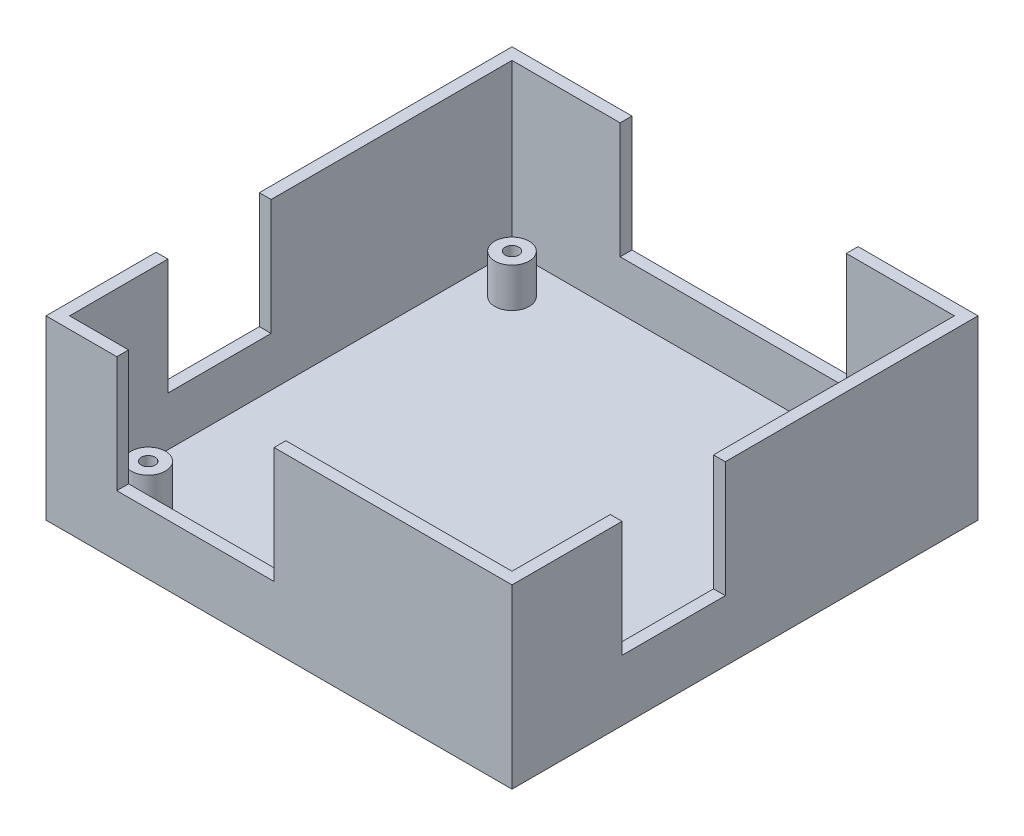
ISO-10303-21;
HEADER;
FILE_DESCRIPTION(('STEP AP214'),'2;1');
FILE_NAME('part.step','',(''),(''),'','','');
FILE_SCHEMA(('AUTOMOTIVE_DESIGN { 1 0 10303 214 1 1 1 1 }'));
ENDSEC;
DATA;
#1=APPLICATION_CONTEXT('core data for automotive mechanical design processes');
#2=APPLICATION_PROTOCOL_DEFINITION('international standard','automotive_design',2000,#1);
#3=PRODUCT_CONTEXT('',#1,'mechanical');
#4=PRODUCT('Part','Part','',(#3));
#5=PRODUCT_RELATED_PRODUCT_CATEGORY('part','',(#4));
#6=PRODUCT_DEFINITION_FORMATION('','',#4);
#7=PRODUCT_DEFINITION_CONTEXT('part definition',#1,'design');
#8=PRODUCT_DEFINITION('design','',#6,#7);
#9=PRODUCT_DEFINITION_SHAPE('','',#8);
#10=(LENGTH_UNIT() NAMED_UNIT(*) SI_UNIT(.MILLI.,.METRE.));
#11=(NAMED_UNIT(*) PLANE_ANGLE_UNIT() SI_UNIT($,.RADIAN.));
#12=(NAMED_UNIT(*) SI_UNIT($,.STERADIAN.) SOLID_ANGLE_UNIT());
#13=UNCERTAINTY_MEASURE_WITH_UNIT(LENGTH_MEASURE(1.E-05),#10,'distance_accuracy_value','');
#14=(GEOMETRIC_REPRESENTATION_CONTEXT(3) GLOBAL_UNCERTAINTY_ASSIGNED_CONTEXT((#13)) GLOBAL_UNIT_ASSIGNED_CONTEXT((#10,
#11,#12)) REPRESENTATION_CONTEXT('',''));
#15=CARTESIAN_POINT('',(0.,0.,0.));
#16=DIRECTION('',(0.,0.,1.));
#17=DIRECTION('',(1.,0.,0.));
#18=AXIS2_PLACEMENT_3D('',#15,#16,#17);
#19=CARTESIAN_POINT('',(0.,18.,0.));
#20=DIRECTION('',(0.,1.,0.));
#21=DIRECTION('',(0.,0.,1.));
#22=AXIS2_PLACEMENT_3D('',#19,#20,#21);
#23=PLANE('',#22);
#24=DIRECTION('',(0.,0.,1.));
#25=VECTOR('',#24,1.);
#26=CARTESIAN_POINT('',(-11.5,18.,-23.7));
#27=LINE('',#26,#25);
#28=CARTESIAN_POINT('',(-11.5,18.,-23.7));
#29=VERTEX_POINT('',#28);
#30=CARTESIAN_POINT('',(-11.5,18.,-22.5));
#31=VERTEX_POINT('',#30);
#32=EDGE_CURVE('E472',#29,#31,#27,.T.);
#33=ORIENTED_EDGE('',*,*,#32,.F.);
#34=DIRECTION('',(-1.,0.,0.));
#35=VECTOR('',#34,1.);
#36=CARTESIAN_POINT('',(-23.7,18.,-23.7));
#37=LINE('',#36,#35);
#38=CARTESIAN_POINT('',(-23.7,18.,-23.7));
#39=VERTEX_POINT('',#38);
#40=EDGE_CURVE('E383',#29,#39,#37,.T.);
#41=ORIENTED_EDGE('',*,*,#40,.T.);
#42=DIRECTION('',(0.,0.,1.));
#43=VECTOR('',#42,1.);
#44=CARTESIAN_POINT('',(-23.7,18.,-23.7));
#45=LINE('',#44,#43);
#46=CARTESIAN_POINT('',(-23.7,18.,2.));
#47=VERTEX_POINT('',#46);
#48=EDGE_CURVE('E389',#39,#47,#45,.T.);
#49=ORIENTED_EDGE('',*,*,#48,.T.);
#50=DIRECTION('',(-1.,0.,0.));
#51=VECTOR('',#50,1.);
#52=CARTESIAN_POINT('',(-22.5,18.,1.99999999999999));
#53=LINE('',#52,#51);
#54=CARTESIAN_POINT('',(-22.5,18.,1.99999999999999));
#55=VERTEX_POINT('',#54);
#56=EDGE_CURVE('E233',#55,#47,#53,.T.);
#57=ORIENTED_EDGE('',*,*,#56,.F.);
#58=DIRECTION('',(0.,0.,1.));
#59=VECTOR('',#58,1.);
#60=CARTESIAN_POINT('',(-22.5,18.,-22.5));
#61=LINE('',#60,#59);
#62=CARTESIAN_POINT('',(-22.5,18.,-22.5));
#63=VERTEX_POINT('',#62);
#64=EDGE_CURVE('E363',#63,#55,#61,.T.);
#65=ORIENTED_EDGE('',*,*,#64,.F.);
#66=DIRECTION('',(-1.,0.,0.));
#67=VECTOR('',#66,1.);
#68=CARTESIAN_POINT('',(-22.5,18.,-22.5));
#69=LINE('',#68,#67);
#70=EDGE_CURVE('E360',#31,#63,#69,.T.);
#71=ORIENTED_EDGE('',*,*,#70,.F.);
#72=EDGE_LOOP('',(#33,#41,#49,#57,#65,#71));
#73=FACE_BOUND('',#72,.T.);
#74=ADVANCED_FACE('F33',(#73),#23,.T.);
#75=DIRECTION('',(1.,0.,0.));
#76=VECTOR('',#75,1.);
#77=CARTESIAN_POINT('',(-22.5,18.,12.5));
#78=LINE('',#77,#76);
#79=CARTESIAN_POINT('',(-23.7,18.,12.5));
#80=VERTEX_POINT('',#79);
#81=CARTESIAN_POINT('',(-22.5,18.,12.5));
#82=VERTEX_POINT('',#81);
#83=EDGE_CURVE('E226',#80,#82,#78,.T.);
#84=ORIENTED_EDGE('',*,*,#83,.F.);
#85=CARTESIAN_POINT('',(-23.7,18.,23.7));
#86=VERTEX_POINT('',#85);
#87=EDGE_CURVE('E388',#80,#86,#45,.T.);
#88=ORIENTED_EDGE('',*,*,#87,.T.);
#89=DIRECTION('',(1.,0.,0.));
#90=VECTOR('',#89,1.);
#91=CARTESIAN_POINT('',(-23.7,18.,23.7));
#92=LINE('',#91,#90);
#93=CARTESIAN_POINT('',(-16.5,18.,23.7));
#94=VERTEX_POINT('',#93);
#95=EDGE_CURVE('E393',#86,#94,#92,.T.);
#96=ORIENTED_EDGE('',*,*,#95,.T.);
#97=DIRECTION('',(0.,0.,1.));
#98=VECTOR('',#97,1.);
#99=CARTESIAN_POINT('',(-16.5,18.,22.5));
#100=LINE('',#99,#98);
#101=CARTESIAN_POINT('',(-16.5,18.,22.5));
#102=VERTEX_POINT('',#101);
#103=EDGE_CURVE('E263',#102,#94,#100,.T.);
#104=ORIENTED_EDGE('',*,*,#103,.F.);
#105=DIRECTION('',(1.,0.,0.));
#106=VECTOR('',#105,1.);
#107=CARTESIAN_POINT('',(-22.5,18.,22.5));
#108=LINE('',#107,#106);
#109=CARTESIAN_POINT('',(-22.5,18.,22.5));
#110=VERTEX_POINT('',#109);
#111=EDGE_CURVE('E347',#110,#102,#108,.T.);
#112=ORIENTED_EDGE('',*,*,#111,.F.);
#113=EDGE_CURVE('E362',#82,#110,#61,.T.);
#114=ORIENTED_EDGE('',*,*,#113,.F.);
#115=EDGE_LOOP('',(#84,#88,#96,#104,#112,#114));
#116=FACE_BOUND('',#115,.T.);
#117=ADVANCED_FACE('F453',(#116),#23,.T.);
#118=DIRECTION('',(0.,0.,-1.));
#119=VECTOR('',#118,1.);
#120=CARTESIAN_POINT('',(11.5,18.,-23.7));
#121=LINE('',#120,#119);
#122=CARTESIAN_POINT('',(11.5,18.,-22.5));
#123=VERTEX_POINT('',#122);
#124=CARTESIAN_POINT('',(11.5,18.,-23.7));
#125=VERTEX_POINT('',#124);
#126=EDGE_CURVE('E477',#123,#125,#121,.T.);
#127=ORIENTED_EDGE('',*,*,#126,.F.);
#128=CARTESIAN_POINT('',(22.5,18.,-22.5));
#129=VERTEX_POINT('',#128);
#130=EDGE_CURVE('E215',#129,#123,#69,.T.);
#131=ORIENTED_EDGE('',*,*,#130,.F.);
#132=DIRECTION('',(0.,0.,-1.));
#133=VECTOR('',#132,1.);
#134=CARTESIAN_POINT('',(22.5,18.,-22.5));
#135=LINE('',#134,#133);
#136=CARTESIAN_POINT('',(22.5,18.,2.));
#137=VERTEX_POINT('',#136);
#138=EDGE_CURVE('E340',#137,#129,#135,.T.);
#139=ORIENTED_EDGE('',*,*,#138,.F.);
#140=DIRECTION('',(-1.,0.,0.));
#141=VECTOR('',#140,1.);
#142=CARTESIAN_POINT('',(22.5,18.,2.));
#143=LINE('',#142,#141);
#144=CARTESIAN_POINT('',(23.7,18.,2.));
#145=VERTEX_POINT('',#144);
#146=EDGE_CURVE('E250',#145,#137,#143,.T.);
#147=ORIENTED_EDGE('',*,*,#146,.F.);
#148=DIRECTION('',(0.,0.,-1.));
#149=VECTOR('',#148,1.);
#150=CARTESIAN_POINT('',(23.7,18.,-23.7));
#151=LINE('',#150,#149);
#152=CARTESIAN_POINT('',(23.7,18.,-23.7));
#153=VERTEX_POINT('',#152);
#154=EDGE_CURVE('E384',#145,#153,#151,.T.);
#155=ORIENTED_EDGE('',*,*,#154,.T.);
#156=EDGE_CURVE('E385',#153,#125,#37,.T.);
#157=ORIENTED_EDGE('',*,*,#156,.T.);
#158=EDGE_LOOP('',(#127,#131,#139,#147,#155,#157));
#159=FACE_BOUND('',#158,.T.);
#160=ADVANCED_FACE('F496',(#159),#23,.T.);
#161=CARTESIAN_POINT('',(0.,1.2,0.));
#162=DIRECTION('',(0.,1.,0.));
#163=DIRECTION('',(0.,0.,1.));
#164=AXIS2_PLACEMENT_3D('',#161,#162,#163);
#165=PLANE('',#164);
#166=CARTESIAN_POINT('',(18.5,1.2,18.5));
#167=DIRECTION('',(0.,1.,0.));
#168=DIRECTION('',(0.,0.,1.));
#169=AXIS2_PLACEMENT_3D('',#166,#167,#168);
#170=CIRCLE('',#169,1.75);
#171=CARTESIAN_POINT('',(18.5,1.2,20.25));
#172=VERTEX_POINT('',#171);
#173=EDGE_CURVE('E322',#172,#172,#170,.T.);
#174=ORIENTED_EDGE('',*,*,#173,.F.);
#175=EDGE_LOOP('',(#174));
#176=FACE_BOUND('',#175,.T.);
#177=CARTESIAN_POINT('',(-18.5,1.2,-18.5));
#178=DIRECTION('',(0.,1.,0.));
#179=DIRECTION('',(0.,0.,1.));
#180=AXIS2_PLACEMENT_3D('',#177,#178,#179);
#181=CIRCLE('',#180,1.75);
#182=CARTESIAN_POINT('',(-18.5,1.2,-16.75));
#183=VERTEX_POINT('',#182);
#184=EDGE_CURVE('E334',#183,#183,#181,.T.);
#185=ORIENTED_EDGE('',*,*,#184,.F.);
#186=EDGE_LOOP('',(#185));
#187=FACE_BOUND('',#186,.T.);
#188=DIRECTION('',(0.,0.,-1.));
#189=VECTOR('',#188,1.);
#190=CARTESIAN_POINT('',(22.5,1.2,-22.5));
#191=LINE('',#190,#189);
#192=CARTESIAN_POINT('',(22.5,1.2,22.5));
#193=VERTEX_POINT('',#192);
#194=CARTESIAN_POINT('',(22.5,1.2,-22.5));
#195=VERTEX_POINT('',#194);
#196=EDGE_CURVE('E343',#193,#195,#191,.T.);
#197=ORIENTED_EDGE('',*,*,#196,.T.);
#198=DIRECTION('',(-1.,0.,0.));
#199=VECTOR('',#198,1.);
#200=CARTESIAN_POINT('',(-22.5,1.2,-22.5));
#201=LINE('',#200,#199);
#202=CARTESIAN_POINT('',(-22.5,1.2,-22.5));
#203=VERTEX_POINT('',#202);
#204=EDGE_CURVE('E346',#195,#203,#201,.T.);
#205=ORIENTED_EDGE('',*,*,#204,.T.);
#206=DIRECTION('',(0.,0.,1.));
#207=VECTOR('',#206,1.);
#208=CARTESIAN_POINT('',(-22.5,1.2,-22.5));
#209=LINE('',#208,#207);
#210=CARTESIAN_POINT('',(-22.5,1.2,22.5));
#211=VERTEX_POINT('',#210);
#212=EDGE_CURVE('E350',#203,#211,#209,.T.);
#213=ORIENTED_EDGE('',*,*,#212,.T.);
#214=DIRECTION('',(1.,0.,0.));
#215=VECTOR('',#214,1.);
#216=CARTESIAN_POINT('',(-22.5,1.2,22.5));
#217=LINE('',#216,#215);
#218=EDGE_CURVE('E353',#211,#193,#217,.T.);
#219=ORIENTED_EDGE('',*,*,#218,.T.);
#220=EDGE_LOOP('',(#197,#205,#213,#219));
#221=FACE_BOUND('',#220,.T.);
#222=CARTESIAN_POINT('',(18.5,1.2,-18.5));
#223=DIRECTION('',(0.,1.,0.));
#224=DIRECTION('',(0.,0.,1.));
#225=AXIS2_PLACEMENT_3D('',#222,#223,#224);
#226=CIRCLE('',#225,1.75);
#227=CARTESIAN_POINT('',(18.5,1.2,-16.75));
#228=VERTEX_POINT('',#227);
#229=EDGE_CURVE('E328',#228,#228,#226,.T.);
#230=ORIENTED_EDGE('',*,*,#229,.F.);
#231=EDGE_LOOP('',(#230));
#232=FACE_BOUND('',#231,.T.);
#233=CARTESIAN_POINT('',(-18.5,1.2,18.5));
#234=DIRECTION('',(0.,1.,0.));
#235=DIRECTION('',(0.,0.,1.));
#236=AXIS2_PLACEMENT_3D('',#233,#234,#235);
#237=CIRCLE('',#236,1.75);
#238=CARTESIAN_POINT('',(-18.5,1.2,20.25));
#239=VERTEX_POINT('',#238);
#240=EDGE_CURVE('E316',#239,#239,#237,.T.);
#241=ORIENTED_EDGE('',*,*,#240,.F.);
#242=EDGE_LOOP('',(#241));
#243=FACE_BOUND('',#242,.T.);
#244=ADVANCED_FACE('F486',(#176,#187,#221,#232,#243),#165,.T.);
#245=CARTESIAN_POINT('',(23.7,18.,-23.7));
#246=DIRECTION('',(-1.,0.,0.));
#247=DIRECTION('',(0.,0.,1.));
#248=AXIS2_PLACEMENT_3D('',#245,#246,#247);
#249=PLANE('',#248);
#250=ORIENTED_EDGE('',*,*,#154,.F.);
#251=DIRECTION('',(0.,1.,0.));
#252=VECTOR('',#251,1.);
#253=CARTESIAN_POINT('',(23.7,6.2,2.));
#254=LINE('',#253,#252);
#255=CARTESIAN_POINT('',(23.7,6.2,2.));
#256=VERTEX_POINT('',#255);
#257=EDGE_CURVE('E264',#256,#145,#254,.T.);
#258=ORIENTED_EDGE('',*,*,#257,.F.);
#259=DIRECTION('',(0.,0.,-1.));
#260=VECTOR('',#259,1.);
#261=CARTESIAN_POINT('',(23.7,6.2,2.));
#262=LINE('',#261,#260);
#263=CARTESIAN_POINT('',(23.7,6.2,12.5));
#264=VERTEX_POINT('',#263);
#265=EDGE_CURVE('E253',#264,#256,#262,.T.);
#266=ORIENTED_EDGE('',*,*,#265,.F.);
#267=DIRECTION('',(0.,1.,0.));
#268=VECTOR('',#267,1.);
#269=CARTESIAN_POINT('',(23.7,6.2,12.5));
#270=LINE('',#269,#268);
#271=CARTESIAN_POINT('',(23.7,18.,12.5));
#272=VERTEX_POINT('',#271);
#273=EDGE_CURVE('E266',#264,#272,#270,.T.);
#274=ORIENTED_EDGE('',*,*,#273,.T.);
#275=CARTESIAN_POINT('',(23.7,18.,23.7));
#276=VERTEX_POINT('',#275);
#277=EDGE_CURVE('E380',#276,#272,#151,.T.);
#278=ORIENTED_EDGE('',*,*,#277,.F.);
#279=DIRECTION('',(0.,-1.,0.));
#280=VECTOR('',#279,1.);
#281=CARTESIAN_POINT('',(23.7,18.,23.7));
#282=LINE('',#281,#280);
#283=CARTESIAN_POINT('',(23.7,0.,23.7));
#284=VERTEX_POINT('',#283);
#285=EDGE_CURVE('E396',#276,#284,#282,.T.);
#286=ORIENTED_EDGE('',*,*,#285,.T.);
#287=DIRECTION('',(0.,0.,-1.));
#288=VECTOR('',#287,1.);
#289=CARTESIAN_POINT('',(23.7,0.,-23.7));
#290=LINE('',#289,#288);
#291=CARTESIAN_POINT('',(23.7,0.,-23.7));
#292=VERTEX_POINT('',#291);
#293=EDGE_CURVE('E372',#284,#292,#290,.T.);
#294=ORIENTED_EDGE('',*,*,#293,.T.);
#295=DIRECTION('',(0.,-1.,0.));
#296=VECTOR('',#295,1.);
#297=CARTESIAN_POINT('',(23.7,18.,-23.7));
#298=LINE('',#297,#296);
#299=EDGE_CURVE('E11',#153,#292,#298,.T.);
#300=ORIENTED_EDGE('',*,*,#299,.F.);
#301=EDGE_LOOP('',(#250,#258,#266,#274,#278,#286,#294,#300));
#302=FACE_BOUND('',#301,.T.);
#303=ADVANCED_FACE('F35',(#302),#249,.F.);
#304=CARTESIAN_POINT('',(-23.7,18.,-23.7));
#305=DIRECTION('',(0.,0.,1.));
#306=DIRECTION('',(1.,0.,0.));
#307=AXIS2_PLACEMENT_3D('',#304,#305,#306);
#308=PLANE('',#307);
#309=ORIENTED_EDGE('',*,*,#40,.F.);
#310=DIRECTION('',(0.,1.,0.));
#311=VECTOR('',#310,1.);
#312=CARTESIAN_POINT('',(-11.5,6.2,-23.7));
#313=LINE('',#312,#311);
#314=CARTESIAN_POINT('',(-11.5,6.2,-23.7));
#315=VERTEX_POINT('',#314);
#316=EDGE_CURVE('E218',#315,#29,#313,.T.);
#317=ORIENTED_EDGE('',*,*,#316,.F.);
#318=DIRECTION('',(-1.,0.,0.));
#319=VECTOR('',#318,1.);
#320=CARTESIAN_POINT('',(-11.5,6.2,-23.7));
#321=LINE('',#320,#319);
#322=CARTESIAN_POINT('',(11.5,6.2,-23.7));
#323=VERTEX_POINT('',#322);
#324=EDGE_CURVE('E203',#323,#315,#321,.T.);
#325=ORIENTED_EDGE('',*,*,#324,.F.);
#326=DIRECTION('',(0.,1.,0.));
#327=VECTOR('',#326,1.);
#328=CARTESIAN_POINT('',(11.5,6.2,-23.7));
#329=LINE('',#328,#327);
#330=EDGE_CURVE('E201',#323,#125,#329,.T.);
#331=ORIENTED_EDGE('',*,*,#330,.T.);
#332=ORIENTED_EDGE('',*,*,#156,.F.);
#333=ORIENTED_EDGE('',*,*,#299,.T.);
#334=DIRECTION('',(-1.,0.,0.));
#335=VECTOR('',#334,1.);
#336=CARTESIAN_POINT('',(-23.7,0.,-23.7));
#337=LINE('',#336,#335);
#338=CARTESIAN_POINT('',(-23.7,0.,-23.7));
#339=VERTEX_POINT('',#338);
#340=EDGE_CURVE('E399',#292,#339,#337,.T.);
#341=ORIENTED_EDGE('',*,*,#340,.T.);
#342=DIRECTION('',(0.,-1.,0.));
#343=VECTOR('',#342,1.);
#344=CARTESIAN_POINT('',(-23.7,18.,-23.7));
#345=LINE('',#344,#343);
#346=EDGE_CURVE('E41',#39,#339,#345,.T.);
#347=ORIENTED_EDGE('',*,*,#346,.F.);
#348=EDGE_LOOP('',(#309,#317,#325,#331,#332,#333,#341,#347));
#349=FACE_BOUND('',#348,.T.);
#350=ADVANCED_FACE('F474',(#349),#308,.F.);
#351=CARTESIAN_POINT('',(-23.7,18.,-23.7));
#352=DIRECTION('',(1.,0.,0.));
#353=DIRECTION('',(0.,0.,-1.));
#354=AXIS2_PLACEMENT_3D('',#351,#352,#353);
#355=PLANE('',#354);
#356=ORIENTED_EDGE('',*,*,#87,.F.);
#357=DIRECTION('',(0.,1.,0.));
#358=VECTOR('',#357,1.);
#359=CARTESIAN_POINT('',(-23.7,6.2,12.5));
#360=LINE('',#359,#358);
#361=CARTESIAN_POINT('',(-23.7,6.2,12.5));
#362=VERTEX_POINT('',#361);
#363=EDGE_CURVE('E240',#362,#80,#360,.T.);
#364=ORIENTED_EDGE('',*,*,#363,.F.);
#365=DIRECTION('',(0.,0.,1.));
#366=VECTOR('',#365,1.);
#367=CARTESIAN_POINT('',(-23.7,6.2,2.));
#368=LINE('',#367,#366);
#369=CARTESIAN_POINT('',(-23.7,6.2,2.));
#370=VERTEX_POINT('',#369);
#371=EDGE_CURVE('E229',#370,#362,#368,.T.);
#372=ORIENTED_EDGE('',*,*,#371,.F.);
#373=DIRECTION('',(0.,1.,0.));
#374=VECTOR('',#373,1.);
#375=CARTESIAN_POINT('',(-23.7,6.2,2.));
#376=LINE('',#375,#374);
#377=EDGE_CURVE('E242',#370,#47,#376,.T.);
#378=ORIENTED_EDGE('',*,*,#377,.T.);
#379=ORIENTED_EDGE('',*,*,#48,.F.);
#380=ORIENTED_EDGE('',*,*,#346,.T.);
#381=DIRECTION('',(0.,0.,1.));
#382=VECTOR('',#381,1.);
#383=CARTESIAN_POINT('',(-23.7,0.,-23.7));
#384=LINE('',#383,#382);
#385=CARTESIAN_POINT('',(-23.7,0.,23.7));
#386=VERTEX_POINT('',#385);
#387=EDGE_CURVE('E401',#339,#386,#384,.T.);
#388=ORIENTED_EDGE('',*,*,#387,.T.);
#389=DIRECTION('',(0.,-1.,0.));
#390=VECTOR('',#389,1.);
#391=CARTESIAN_POINT('',(-23.7,18.,23.7));
#392=LINE('',#391,#390);
#393=EDGE_CURVE('E407',#86,#386,#392,.T.);
#394=ORIENTED_EDGE('',*,*,#393,.F.);
#395=EDGE_LOOP('',(#356,#364,#372,#378,#379,#380,#388,#394));
#396=FACE_BOUND('',#395,.T.);
#397=ADVANCED_FACE('F415',(#396),#355,.F.);
#398=CARTESIAN_POINT('',(-23.7,18.,23.7));
#399=DIRECTION('',(0.,0.,-1.));
#400=DIRECTION('',(-1.,0.,0.));
#401=AXIS2_PLACEMENT_3D('',#398,#399,#400);
#402=PLANE('',#401);
#403=DIRECTION('',(1.,0.,0.));
#404=VECTOR('',#403,1.);
#405=CARTESIAN_POINT('',(-16.5,6.2,23.7));
#406=LINE('',#405,#404);
#407=CARTESIAN_POINT('',(-16.5,6.2,23.7));
#408=VERTEX_POINT('',#407);
#409=CARTESIAN_POINT('',(-0.500000000000007,6.2,23.7));
#410=VERTEX_POINT('',#409);
#411=EDGE_CURVE('E273',#408,#410,#406,.T.);
#412=ORIENTED_EDGE('',*,*,#411,.F.);
#413=DIRECTION('',(0.,1.,0.));
#414=VECTOR('',#413,1.);
#415=CARTESIAN_POINT('',(-16.5,6.2,23.7));
#416=LINE('',#415,#414);
#417=EDGE_CURVE('E282',#408,#94,#416,.T.);
#418=ORIENTED_EDGE('',*,*,#417,.T.);
#419=ORIENTED_EDGE('',*,*,#95,.F.);
#420=ORIENTED_EDGE('',*,*,#393,.T.);
#421=DIRECTION('',(1.,0.,0.));
#422=VECTOR('',#421,1.);
#423=CARTESIAN_POINT('',(-23.7,0.,23.7));
#424=LINE('',#423,#422);
#425=EDGE_CURVE('E403',#386,#284,#424,.T.);
#426=ORIENTED_EDGE('',*,*,#425,.T.);
#427=ORIENTED_EDGE('',*,*,#285,.F.);
#428=CARTESIAN_POINT('',(-0.500000000000007,18.,23.7));
#429=VERTEX_POINT('',#428);
#430=EDGE_CURVE('E392',#429,#276,#92,.T.);
#431=ORIENTED_EDGE('',*,*,#430,.F.);
#432=DIRECTION('',(0.,1.,0.));
#433=VECTOR('',#432,1.);
#434=CARTESIAN_POINT('',(-0.500000000000007,6.2,23.7));
#435=LINE('',#434,#433);
#436=EDGE_CURVE('E291',#410,#429,#435,.T.);
#437=ORIENTED_EDGE('',*,*,#436,.F.);
#438=EDGE_LOOP('',(#412,#418,#419,#420,#426,#427,#431,#437));
#439=FACE_BOUND('',#438,.T.);
#440=ADVANCED_FACE('F426',(#439),#402,.F.);
#441=DIRECTION('',(1.,0.,0.));
#442=VECTOR('',#441,1.);
#443=CARTESIAN_POINT('',(22.5,18.,12.5));
#444=LINE('',#443,#442);
#445=CARTESIAN_POINT('',(22.5,18.,12.5));
#446=VERTEX_POINT('',#445);
#447=EDGE_CURVE('E239',#446,#272,#444,.T.);
#448=ORIENTED_EDGE('',*,*,#447,.F.);
#449=CARTESIAN_POINT('',(22.5,18.,22.5));
#450=VERTEX_POINT('',#449);
#451=EDGE_CURVE('E357',#450,#446,#135,.T.);
#452=ORIENTED_EDGE('',*,*,#451,.F.);
#453=CARTESIAN_POINT('',(-0.500000000000007,18.,22.5));
#454=VERTEX_POINT('',#453);
#455=EDGE_CURVE('E366',#454,#450,#108,.T.);
#456=ORIENTED_EDGE('',*,*,#455,.F.);
#457=DIRECTION('',(0.,0.,-1.));
#458=VECTOR('',#457,1.);
#459=CARTESIAN_POINT('',(-0.500000000000007,18.,22.5));
#460=LINE('',#459,#458);
#461=EDGE_CURVE('E274',#429,#454,#460,.T.);
#462=ORIENTED_EDGE('',*,*,#461,.F.);
#463=ORIENTED_EDGE('',*,*,#430,.T.);
#464=ORIENTED_EDGE('',*,*,#277,.T.);
#465=EDGE_LOOP('',(#448,#452,#456,#462,#463,#464));
#466=FACE_BOUND('',#465,.T.);
#467=ADVANCED_FACE('F436',(#466),#23,.T.);
#468=CARTESIAN_POINT('',(0.,0.,0.));
#469=DIRECTION('',(0.,1.,0.));
#470=DIRECTION('',(0.,0.,1.));
#471=AXIS2_PLACEMENT_3D('',#468,#469,#470);
#472=PLANE('',#471);
#473=ORIENTED_EDGE('',*,*,#293,.F.);
#474=ORIENTED_EDGE('',*,*,#425,.F.);
#475=ORIENTED_EDGE('',*,*,#387,.F.);
#476=ORIENTED_EDGE('',*,*,#340,.F.);
#477=EDGE_LOOP('',(#473,#474,#475,#476));
#478=FACE_BOUND('',#477,.T.);
#479=ADVANCED_FACE('F422',(#478),#472,.F.);
#480=CARTESIAN_POINT('',(22.5,1.2,-22.5));
#481=DIRECTION('',(1.,0.,0.));
#482=DIRECTION('',(0.,0.,-1.));
#483=AXIS2_PLACEMENT_3D('',#480,#481,#482);
#484=PLANE('',#483);
#485=DIRECTION('',(0.,0.,1.));
#486=VECTOR('',#485,1.);
#487=CARTESIAN_POINT('',(22.5,6.2,2.));
#488=LINE('',#487,#486);
#489=CARTESIAN_POINT('',(22.5,6.2,2.));
#490=VERTEX_POINT('',#489);
#491=CARTESIAN_POINT('',(22.5,6.2,12.5));
#492=VERTEX_POINT('',#491);
#493=EDGE_CURVE('E246',#490,#492,#488,.T.);
#494=ORIENTED_EDGE('',*,*,#493,.F.);
#495=DIRECTION('',(0.,1.,0.));
#496=VECTOR('',#495,1.);
#497=CARTESIAN_POINT('',(22.5,6.2,2.));
#498=LINE('',#497,#496);
#499=EDGE_CURVE('E260',#490,#137,#498,.T.);
#500=ORIENTED_EDGE('',*,*,#499,.T.);
#501=ORIENTED_EDGE('',*,*,#138,.T.);
#502=DIRECTION('',(0.,1.,0.));
#503=VECTOR('',#502,1.);
#504=CARTESIAN_POINT('',(22.5,1.2,-22.5));
#505=LINE('',#504,#503);
#506=EDGE_CURVE('E356',#195,#129,#505,.T.);
#507=ORIENTED_EDGE('',*,*,#506,.F.);
#508=ORIENTED_EDGE('',*,*,#196,.F.);
#509=DIRECTION('',(0.,1.,0.));
#510=VECTOR('',#509,1.);
#511=CARTESIAN_POINT('',(22.5,1.2,22.5));
#512=LINE('',#511,#510);
#513=EDGE_CURVE('E369',#193,#450,#512,.T.);
#514=ORIENTED_EDGE('',*,*,#513,.T.);
#515=ORIENTED_EDGE('',*,*,#451,.T.);
#516=DIRECTION('',(0.,1.,0.));
#517=VECTOR('',#516,1.);
#518=CARTESIAN_POINT('',(22.5,6.2,12.5));
#519=LINE('',#518,#517);
#520=EDGE_CURVE('E257',#492,#446,#519,.T.);
#521=ORIENTED_EDGE('',*,*,#520,.F.);
#522=EDGE_LOOP('',(#494,#500,#501,#507,#508,#514,#515,#521));
#523=FACE_BOUND('',#522,.T.);
#524=ADVANCED_FACE('F491',(#523),#484,.F.);
#525=CARTESIAN_POINT('',(-22.5,1.2,22.5));
#526=DIRECTION('',(0.,0.,1.));
#527=DIRECTION('',(1.,0.,0.));
#528=AXIS2_PLACEMENT_3D('',#525,#526,#527);
#529=PLANE('',#528);
#530=ORIENTED_EDGE('',*,*,#111,.T.);
#531=DIRECTION('',(0.,1.,0.));
#532=VECTOR('',#531,1.);
#533=CARTESIAN_POINT('',(-16.5,6.2,22.5));
#534=LINE('',#533,#532);
#535=CARTESIAN_POINT('',(-16.5,6.2,22.5));
#536=VERTEX_POINT('',#535);
#537=EDGE_CURVE('E285',#536,#102,#534,.T.);
#538=ORIENTED_EDGE('',*,*,#537,.F.);
#539=DIRECTION('',(-1.,0.,0.));
#540=VECTOR('',#539,1.);
#541=CARTESIAN_POINT('',(-16.5,6.2,22.5));
#542=LINE('',#541,#540);
#543=CARTESIAN_POINT('',(-0.500000000000007,6.2,22.5));
#544=VERTEX_POINT('',#543);
#545=EDGE_CURVE('E279',#544,#536,#542,.T.);
#546=ORIENTED_EDGE('',*,*,#545,.F.);
#547=DIRECTION('',(0.,1.,0.));
#548=VECTOR('',#547,1.);
#549=CARTESIAN_POINT('',(-0.500000000000007,6.2,22.5));
#550=LINE('',#549,#548);
#551=EDGE_CURVE('E288',#544,#454,#550,.T.);
#552=ORIENTED_EDGE('',*,*,#551,.T.);
#553=ORIENTED_EDGE('',*,*,#455,.T.);
#554=ORIENTED_EDGE('',*,*,#513,.F.);
#555=ORIENTED_EDGE('',*,*,#218,.F.);
#556=DIRECTION('',(0.,1.,0.));
#557=VECTOR('',#556,1.);
#558=CARTESIAN_POINT('',(-22.5,1.2,22.5));
#559=LINE('',#558,#557);
#560=EDGE_CURVE('E373',#211,#110,#559,.T.);
#561=ORIENTED_EDGE('',*,*,#560,.T.);
#562=EDGE_LOOP('',(#530,#538,#546,#552,#553,#554,#555,#561));
#563=FACE_BOUND('',#562,.T.);
#564=ADVANCED_FACE('F508',(#563),#529,.F.);
#565=CARTESIAN_POINT('',(-22.5,1.2,-22.5));
#566=DIRECTION('',(-1.,0.,0.));
#567=DIRECTION('',(0.,0.,1.));
#568=AXIS2_PLACEMENT_3D('',#565,#566,#567);
#569=PLANE('',#568);
#570=DIRECTION('',(0.,0.,-1.));
#571=VECTOR('',#570,1.);
#572=CARTESIAN_POINT('',(-22.5,6.2,1.99999999999999));
#573=LINE('',#572,#571);
#574=CARTESIAN_POINT('',(-22.5,6.2,12.5));
#575=VERTEX_POINT('',#574);
#576=CARTESIAN_POINT('',(-22.5,6.2,1.99999999999999));
#577=VERTEX_POINT('',#576);
#578=EDGE_CURVE('E223',#575,#577,#573,.T.);
#579=ORIENTED_EDGE('',*,*,#578,.F.);
#580=DIRECTION('',(0.,1.,0.));
#581=VECTOR('',#580,1.);
#582=CARTESIAN_POINT('',(-22.5,6.2,12.5));
#583=LINE('',#582,#581);
#584=EDGE_CURVE('E236',#575,#82,#583,.T.);
#585=ORIENTED_EDGE('',*,*,#584,.T.);
#586=ORIENTED_EDGE('',*,*,#113,.T.);
#587=ORIENTED_EDGE('',*,*,#560,.F.);
#588=ORIENTED_EDGE('',*,*,#212,.F.);
#589=DIRECTION('',(0.,1.,0.));
#590=VECTOR('',#589,1.);
#591=CARTESIAN_POINT('',(-22.5,1.2,-22.5));
#592=LINE('',#591,#590);
#593=EDGE_CURVE('E376',#203,#63,#592,.T.);
#594=ORIENTED_EDGE('',*,*,#593,.T.);
#595=ORIENTED_EDGE('',*,*,#64,.T.);
#596=DIRECTION('',(0.,1.,0.));
#597=VECTOR('',#596,1.);
#598=CARTESIAN_POINT('',(-22.5,6.2,1.99999999999999));
#599=LINE('',#598,#597);
#600=EDGE_CURVE('E232',#577,#55,#599,.T.);
#601=ORIENTED_EDGE('',*,*,#600,.F.);
#602=EDGE_LOOP('',(#579,#585,#586,#587,#588,#594,#595,#601));
#603=FACE_BOUND('',#602,.T.);
#604=ADVANCED_FACE('F463',(#603),#569,.F.);
#605=CARTESIAN_POINT('',(-22.5,1.2,-22.5));
#606=DIRECTION('',(0.,0.,-1.));
#607=DIRECTION('',(-1.,0.,0.));
#608=AXIS2_PLACEMENT_3D('',#605,#606,#607);
#609=PLANE('',#608);
#610=DIRECTION('',(1.,0.,0.));
#611=VECTOR('',#610,1.);
#612=CARTESIAN_POINT('',(-11.5,6.2,-22.5));
#613=LINE('',#612,#611);
#614=CARTESIAN_POINT('',(-11.5,6.2,-22.5));
#615=VERTEX_POINT('',#614);
#616=CARTESIAN_POINT('',(11.5,6.2,-22.5));
#617=VERTEX_POINT('',#616);
#618=EDGE_CURVE('E204',#615,#617,#613,.T.);
#619=ORIENTED_EDGE('',*,*,#618,.F.);
#620=DIRECTION('',(0.,1.,0.));
#621=VECTOR('',#620,1.);
#622=CARTESIAN_POINT('',(-11.5,6.2,-22.5));
#623=LINE('',#622,#621);
#624=EDGE_CURVE('E216',#615,#31,#623,.T.);
#625=ORIENTED_EDGE('',*,*,#624,.T.);
#626=ORIENTED_EDGE('',*,*,#70,.T.);
#627=ORIENTED_EDGE('',*,*,#593,.F.);
#628=ORIENTED_EDGE('',*,*,#204,.F.);
#629=ORIENTED_EDGE('',*,*,#506,.T.);
#630=ORIENTED_EDGE('',*,*,#130,.T.);
#631=DIRECTION('',(0.,1.,0.));
#632=VECTOR('',#631,1.);
#633=CARTESIAN_POINT('',(11.5,6.2,-22.5));
#634=LINE('',#633,#632);
#635=EDGE_CURVE('E198',#617,#123,#634,.T.);
#636=ORIENTED_EDGE('',*,*,#635,.F.);
#637=EDGE_LOOP('',(#619,#625,#626,#627,#628,#629,#630,#636));
#638=FACE_BOUND('',#637,.T.);
#639=ADVANCED_FACE('F212',(#638),#609,.F.);
#640=CARTESIAN_POINT('',(-18.5,5.2,-18.5));
#641=DIRECTION('',(0.,-1.,0.));
#642=DIRECTION('',(0.,0.,-1.));
#643=AXIS2_PLACEMENT_3D('',#640,#641,#642);
#644=CYLINDRICAL_SURFACE('',#643,1.75);
#645=CARTESIAN_POINT('',(-18.5,5.2,-18.5));
#646=DIRECTION('',(0.,1.,0.));
#647=DIRECTION('',(0.,0.,1.));
#648=AXIS2_PLACEMENT_3D('',#645,#646,#647);
#649=CIRCLE('',#648,1.75);
#650=CARTESIAN_POINT('',(-18.5,5.2,-16.75));
#651=VERTEX_POINT('',#650);
#652=EDGE_CURVE('E337',#651,#651,#649,.T.);
#653=ORIENTED_EDGE('',*,*,#652,.F.);
#654=EDGE_LOOP('',(#653));
#655=FACE_BOUND('',#654,.T.);
#656=ORIENTED_EDGE('',*,*,#184,.T.);
#657=EDGE_LOOP('',(#656));
#658=FACE_BOUND('',#657,.T.);
#659=ADVANCED_FACE('F544',(#655,#658),#644,.T.);
#660=CARTESIAN_POINT('',(-18.5,5.2,-18.5));
#661=DIRECTION('',(0.,1.,0.));
#662=DIRECTION('',(0.,0.,1.));
#663=AXIS2_PLACEMENT_3D('',#660,#661,#662);
#664=PLANE('',#663);
#665=CARTESIAN_POINT('',(-18.5,5.2,-18.5));
#666=DIRECTION('',(0.,1.,0.));
#667=DIRECTION('',(0.,0.,1.));
#668=AXIS2_PLACEMENT_3D('',#665,#666,#667);
#669=CIRCLE('',#668,0.699999999999998);
#670=CARTESIAN_POINT('',(-18.5,5.2,-17.8));
#671=VERTEX_POINT('',#670);
#672=EDGE_CURVE('E304',#671,#671,#669,.T.);
#673=ORIENTED_EDGE('',*,*,#672,.F.);
#674=EDGE_LOOP('',(#673));
#675=FACE_BOUND('',#674,.T.);
#676=ORIENTED_EDGE('',*,*,#652,.T.);
#677=EDGE_LOOP('',(#676));
#678=FACE_BOUND('',#677,.T.);
#679=ADVANCED_FACE('F547',(#675,#678),#664,.T.);
#680=CARTESIAN_POINT('',(18.5,5.2,-18.5));
#681=DIRECTION('',(0.,-1.,0.));
#682=DIRECTION('',(0.,0.,-1.));
#683=AXIS2_PLACEMENT_3D('',#680,#681,#682);
#684=CYLINDRICAL_SURFACE('',#683,1.75);
#685=CARTESIAN_POINT('',(18.5,5.2,-18.5));
#686=DIRECTION('',(0.,1.,0.));
#687=DIRECTION('',(0.,0.,1.));
#688=AXIS2_PLACEMENT_3D('',#685,#686,#687);
#689=CIRCLE('',#688,1.75);
#690=CARTESIAN_POINT('',(18.5,5.2,-16.75));
#691=VERTEX_POINT('',#690);
#692=EDGE_CURVE('E331',#691,#691,#689,.T.);
#693=ORIENTED_EDGE('',*,*,#692,.F.);
#694=EDGE_LOOP('',(#693));
#695=FACE_BOUND('',#694,.T.);
#696=ORIENTED_EDGE('',*,*,#229,.T.);
#697=EDGE_LOOP('',(#696));
#698=FACE_BOUND('',#697,.T.);
#699=ADVANCED_FACE('F551',(#695,#698),#684,.T.);
#700=CARTESIAN_POINT('',(18.5,5.2,-18.5));
#701=DIRECTION('',(0.,1.,0.));
#702=DIRECTION('',(0.,0.,1.));
#703=AXIS2_PLACEMENT_3D('',#700,#701,#702);
#704=PLANE('',#703);
#705=CARTESIAN_POINT('',(18.5,5.2,-18.5));
#706=DIRECTION('',(0.,1.,0.));
#707=DIRECTION('',(0.,0.,1.));
#708=AXIS2_PLACEMENT_3D('',#705,#706,#707);
#709=CIRCLE('',#708,0.699999999999998);
#710=CARTESIAN_POINT('',(18.5,5.2,-17.8));
#711=VERTEX_POINT('',#710);
#712=EDGE_CURVE('E298',#711,#711,#709,.T.);
#713=ORIENTED_EDGE('',*,*,#712,.F.);
#714=EDGE_LOOP('',(#713));
#715=FACE_BOUND('',#714,.T.);
#716=ORIENTED_EDGE('',*,*,#692,.T.);
#717=EDGE_LOOP('',(#716));
#718=FACE_BOUND('',#717,.T.);
#719=ADVANCED_FACE('F555',(#715,#718),#704,.T.);
#720=CARTESIAN_POINT('',(18.5,5.2,18.5));
#721=DIRECTION('',(0.,-1.,0.));
#722=DIRECTION('',(0.,0.,-1.));
#723=AXIS2_PLACEMENT_3D('',#720,#721,#722);
#724=CYLINDRICAL_SURFACE('',#723,1.75);
#725=CARTESIAN_POINT('',(18.5,5.2,18.5));
#726=DIRECTION('',(0.,1.,0.));
#727=DIRECTION('',(0.,0.,1.));
#728=AXIS2_PLACEMENT_3D('',#725,#726,#727);
#729=CIRCLE('',#728,1.75);
#730=CARTESIAN_POINT('',(18.5,5.2,20.25));
#731=VERTEX_POINT('',#730);
#732=EDGE_CURVE('E325',#731,#731,#729,.T.);
#733=ORIENTED_EDGE('',*,*,#732,.F.);
#734=EDGE_LOOP('',(#733));
#735=FACE_BOUND('',#734,.T.);
#736=ORIENTED_EDGE('',*,*,#173,.T.);
#737=EDGE_LOOP('',(#736));
#738=FACE_BOUND('',#737,.T.);
#739=ADVANCED_FACE('F559',(#735,#738),#724,.T.);
#740=CARTESIAN_POINT('',(18.5,5.2,18.5));
#741=DIRECTION('',(0.,1.,0.));
#742=DIRECTION('',(0.,0.,1.));
#743=AXIS2_PLACEMENT_3D('',#740,#741,#742);
#744=PLANE('',#743);
#745=CARTESIAN_POINT('',(18.5,5.2,18.5));
#746=DIRECTION('',(0.,1.,0.));
#747=DIRECTION('',(0.,0.,1.));
#748=AXIS2_PLACEMENT_3D('',#745,#746,#747);
#749=CIRCLE('',#748,0.699999999999998);
#750=CARTESIAN_POINT('',(18.5,5.2,19.2));
#751=VERTEX_POINT('',#750);
#752=EDGE_CURVE('E287',#751,#751,#749,.T.);
#753=ORIENTED_EDGE('',*,*,#752,.F.);
#754=EDGE_LOOP('',(#753));
#755=FACE_BOUND('',#754,.T.);
#756=ORIENTED_EDGE('',*,*,#732,.T.);
#757=EDGE_LOOP('',(#756));
#758=FACE_BOUND('',#757,.T.);
#759=ADVANCED_FACE('F563',(#755,#758),#744,.T.);
#760=CARTESIAN_POINT('',(-18.5,5.2,18.5));
#761=DIRECTION('',(0.,-1.,0.));
#762=DIRECTION('',(0.,0.,-1.));
#763=AXIS2_PLACEMENT_3D('',#760,#761,#762);
#764=CYLINDRICAL_SURFACE('',#763,1.75);
#765=CARTESIAN_POINT('',(-18.5,5.2,18.5));
#766=DIRECTION('',(0.,1.,0.));
#767=DIRECTION('',(0.,0.,1.));
#768=AXIS2_PLACEMENT_3D('',#765,#766,#767);
#769=CIRCLE('',#768,1.75);
#770=CARTESIAN_POINT('',(-18.5,5.2,20.25));
#771=VERTEX_POINT('',#770);
#772=EDGE_CURVE('E319',#771,#771,#769,.T.);
#773=ORIENTED_EDGE('',*,*,#772,.F.);
#774=EDGE_LOOP('',(#773));
#775=FACE_BOUND('',#774,.T.);
#776=ORIENTED_EDGE('',*,*,#240,.T.);
#777=EDGE_LOOP('',(#776));
#778=FACE_BOUND('',#777,.T.);
#779=ADVANCED_FACE('F567',(#775,#778),#764,.T.);
#780=CARTESIAN_POINT('',(-18.5,5.2,18.5));
#781=DIRECTION('',(0.,1.,0.));
#782=DIRECTION('',(0.,0.,1.));
#783=AXIS2_PLACEMENT_3D('',#780,#781,#782);
#784=PLANE('',#783);
#785=CARTESIAN_POINT('',(-18.5,5.2,18.5));
#786=DIRECTION('',(0.,1.,0.));
#787=DIRECTION('',(0.,0.,1.));
#788=AXIS2_PLACEMENT_3D('',#785,#786,#787);
#789=CIRCLE('',#788,0.699999999999998);
#790=CARTESIAN_POINT('',(-18.5,5.2,19.2));
#791=VERTEX_POINT('',#790);
#792=EDGE_CURVE('E310',#791,#791,#789,.T.);
#793=ORIENTED_EDGE('',*,*,#792,.F.);
#794=EDGE_LOOP('',(#793));
#795=FACE_BOUND('',#794,.T.);
#796=ORIENTED_EDGE('',*,*,#772,.T.);
#797=EDGE_LOOP('',(#796));
#798=FACE_BOUND('',#797,.T.);
#799=ADVANCED_FACE('F571',(#795,#798),#784,.T.);
#800=CARTESIAN_POINT('',(-18.5,2.2,18.5));
#801=DIRECTION('',(0.,1.,0.));
#802=DIRECTION('',(0.,0.,1.));
#803=AXIS2_PLACEMENT_3D('',#800,#801,#802);
#804=CYLINDRICAL_SURFACE('',#803,0.699999999999998);
#805=CARTESIAN_POINT('',(-18.5,2.2,18.5));
#806=DIRECTION('',(0.,1.,0.));
#807=DIRECTION('',(0.,0.,1.));
#808=AXIS2_PLACEMENT_3D('',#805,#806,#807);
#809=CIRCLE('',#808,0.699999999999998);
#810=CARTESIAN_POINT('',(-18.5,2.2,19.2));
#811=VERTEX_POINT('',#810);
#812=EDGE_CURVE('E313',#811,#811,#809,.T.);
#813=ORIENTED_EDGE('',*,*,#812,.F.);
#814=EDGE_LOOP('',(#813));
#815=FACE_BOUND('',#814,.T.);
#816=ORIENTED_EDGE('',*,*,#792,.T.);
#817=EDGE_LOOP('',(#816));
#818=FACE_BOUND('',#817,.T.);
#819=ADVANCED_FACE('F575',(#815,#818),#804,.F.);
#820=CARTESIAN_POINT('',(-18.5,2.2,18.5));
#821=DIRECTION('',(0.,1.,0.));
#822=DIRECTION('',(0.,0.,1.));
#823=AXIS2_PLACEMENT_3D('',#820,#821,#822);
#824=PLANE('',#823);
#825=ORIENTED_EDGE('',*,*,#812,.T.);
#826=EDGE_LOOP('',(#825));
#827=FACE_BOUND('',#826,.T.);
#828=ADVANCED_FACE('F579',(#827),#824,.T.);
#829=CARTESIAN_POINT('',(-18.5,2.2,-18.5));
#830=DIRECTION('',(0.,1.,0.));
#831=DIRECTION('',(0.,0.,1.));
#832=AXIS2_PLACEMENT_3D('',#829,#830,#831);
#833=CYLINDRICAL_SURFACE('',#832,0.699999999999998);
#834=CARTESIAN_POINT('',(-18.5,2.2,-18.5));
#835=DIRECTION('',(0.,1.,0.));
#836=DIRECTION('',(0.,0.,1.));
#837=AXIS2_PLACEMENT_3D('',#834,#835,#836);
#838=CIRCLE('',#837,0.699999999999998);
#839=CARTESIAN_POINT('',(-18.5,2.2,-17.8));
#840=VERTEX_POINT('',#839);
#841=EDGE_CURVE('E307',#840,#840,#838,.T.);
#842=ORIENTED_EDGE('',*,*,#841,.F.);
#843=EDGE_LOOP('',(#842));
#844=FACE_BOUND('',#843,.T.);
#845=ORIENTED_EDGE('',*,*,#672,.T.);
#846=EDGE_LOOP('',(#845));
#847=FACE_BOUND('',#846,.T.);
#848=ADVANCED_FACE('F583',(#844,#847),#833,.F.);
#849=CARTESIAN_POINT('',(-18.5,2.2,-18.5));
#850=DIRECTION('',(0.,1.,0.));
#851=DIRECTION('',(0.,0.,1.));
#852=AXIS2_PLACEMENT_3D('',#849,#850,#851);
#853=PLANE('',#852);
#854=ORIENTED_EDGE('',*,*,#841,.T.);
#855=EDGE_LOOP('',(#854));
#856=FACE_BOUND('',#855,.T.);
#857=ADVANCED_FACE('F587',(#856),#853,.T.);
#858=CARTESIAN_POINT('',(18.5,2.2,-18.5));
#859=DIRECTION('',(0.,1.,0.));
#860=DIRECTION('',(0.,0.,1.));
#861=AXIS2_PLACEMENT_3D('',#858,#859,#860);
#862=CYLINDRICAL_SURFACE('',#861,0.699999999999998);
#863=CARTESIAN_POINT('',(18.5,2.2,-18.5));
#864=DIRECTION('',(0.,1.,0.));
#865=DIRECTION('',(0.,0.,1.));
#866=AXIS2_PLACEMENT_3D('',#863,#864,#865);
#867=CIRCLE('',#866,0.699999999999998);
#868=CARTESIAN_POINT('',(18.5,2.2,-17.8));
#869=VERTEX_POINT('',#868);
#870=EDGE_CURVE('E301',#869,#869,#867,.T.);
#871=ORIENTED_EDGE('',*,*,#870,.F.);
#872=EDGE_LOOP('',(#871));
#873=FACE_BOUND('',#872,.T.);
#874=ORIENTED_EDGE('',*,*,#712,.T.);
#875=EDGE_LOOP('',(#874));
#876=FACE_BOUND('',#875,.T.);
#877=ADVANCED_FACE('F591',(#873,#876),#862,.F.);
#878=CARTESIAN_POINT('',(18.5,2.2,-18.5));
#879=DIRECTION('',(0.,1.,0.));
#880=DIRECTION('',(0.,0.,1.));
#881=AXIS2_PLACEMENT_3D('',#878,#879,#880);
#882=PLANE('',#881);
#883=ORIENTED_EDGE('',*,*,#870,.T.);
#884=EDGE_LOOP('',(#883));
#885=FACE_BOUND('',#884,.T.);
#886=ADVANCED_FACE('F595',(#885),#882,.T.);
#887=CARTESIAN_POINT('',(18.5,2.2,18.5));
#888=DIRECTION('',(0.,1.,0.));
#889=DIRECTION('',(0.,0.,1.));
#890=AXIS2_PLACEMENT_3D('',#887,#888,#889);
#891=CYLINDRICAL_SURFACE('',#890,0.699999999999998);
#892=CARTESIAN_POINT('',(18.5,2.2,18.5));
#893=DIRECTION('',(0.,1.,0.));
#894=DIRECTION('',(0.,0.,1.));
#895=AXIS2_PLACEMENT_3D('',#892,#893,#894);
#896=CIRCLE('',#895,0.699999999999998);
#897=CARTESIAN_POINT('',(18.5,2.2,19.2));
#898=VERTEX_POINT('',#897);
#899=EDGE_CURVE('E295',#898,#898,#896,.T.);
#900=ORIENTED_EDGE('',*,*,#899,.F.);
#901=EDGE_LOOP('',(#900));
#902=FACE_BOUND('',#901,.T.);
#903=ORIENTED_EDGE('',*,*,#752,.T.);
#904=EDGE_LOOP('',(#903));
#905=FACE_BOUND('',#904,.T.);
#906=ADVANCED_FACE('F599',(#902,#905),#891,.F.);
#907=CARTESIAN_POINT('',(18.5,2.2,18.5));
#908=DIRECTION('',(0.,1.,0.));
#909=DIRECTION('',(0.,0.,1.));
#910=AXIS2_PLACEMENT_3D('',#907,#908,#909);
#911=PLANE('',#910);
#912=ORIENTED_EDGE('',*,*,#899,.T.);
#913=EDGE_LOOP('',(#912));
#914=FACE_BOUND('',#913,.T.);
#915=ADVANCED_FACE('F603',(#914),#911,.T.);
#916=CARTESIAN_POINT('',(-16.5,6.2,22.5));
#917=DIRECTION('',(-1.,0.,0.));
#918=DIRECTION('',(0.,0.,1.));
#919=AXIS2_PLACEMENT_3D('',#916,#917,#918);
#920=PLANE('',#919);
#921=ORIENTED_EDGE('',*,*,#103,.T.);
#922=ORIENTED_EDGE('',*,*,#417,.F.);
#923=DIRECTION('',(0.,0.,1.));
#924=VECTOR('',#923,1.);
#925=CARTESIAN_POINT('',(-16.5,6.2,22.5));
#926=LINE('',#925,#924);
#927=EDGE_CURVE('E270',#536,#408,#926,.T.);
#928=ORIENTED_EDGE('',*,*,#927,.F.);
#929=ORIENTED_EDGE('',*,*,#537,.T.);
#930=EDGE_LOOP('',(#921,#922,#928,#929));
#931=FACE_BOUND('',#930,.T.);
#932=ADVANCED_FACE('F449',(#931),#920,.F.);
#933=CARTESIAN_POINT('',(-0.500000000000007,6.2,22.5));
#934=DIRECTION('',(1.,0.,0.));
#935=DIRECTION('',(0.,0.,-1.));
#936=AXIS2_PLACEMENT_3D('',#933,#934,#935);
#937=PLANE('',#936);
#938=ORIENTED_EDGE('',*,*,#461,.T.);
#939=ORIENTED_EDGE('',*,*,#551,.F.);
#940=DIRECTION('',(0.,0.,-1.));
#941=VECTOR('',#940,1.);
#942=CARTESIAN_POINT('',(-0.500000000000007,6.2,22.5));
#943=LINE('',#942,#941);
#944=EDGE_CURVE('E277',#410,#544,#943,.T.);
#945=ORIENTED_EDGE('',*,*,#944,.F.);
#946=ORIENTED_EDGE('',*,*,#436,.T.);
#947=EDGE_LOOP('',(#938,#939,#945,#946));
#948=FACE_BOUND('',#947,.T.);
#949=ADVANCED_FACE('F442',(#948),#937,.F.);
#950=CARTESIAN_POINT('',(0.,6.2,0.));
#951=DIRECTION('',(0.,1.,0.));
#952=DIRECTION('',(0.,0.,1.));
#953=AXIS2_PLACEMENT_3D('',#950,#951,#952);
#954=PLANE('',#953);
#955=ORIENTED_EDGE('',*,*,#927,.T.);
#956=ORIENTED_EDGE('',*,*,#411,.T.);
#957=ORIENTED_EDGE('',*,*,#944,.T.);
#958=ORIENTED_EDGE('',*,*,#545,.T.);
#959=EDGE_LOOP('',(#955,#956,#957,#958));
#960=FACE_BOUND('',#959,.T.);
#961=ADVANCED_FACE('F446',(#960),#954,.T.);
#962=CARTESIAN_POINT('',(22.5,6.2,2.));
#963=DIRECTION('',(0.,0.,-1.));
#964=DIRECTION('',(-1.,0.,0.));
#965=AXIS2_PLACEMENT_3D('',#962,#963,#964);
#966=PLANE('',#965);
#967=ORIENTED_EDGE('',*,*,#146,.T.);
#968=ORIENTED_EDGE('',*,*,#499,.F.);
#969=DIRECTION('',(-1.,0.,0.));
#970=VECTOR('',#969,1.);
#971=CARTESIAN_POINT('',(22.5,6.2,2.));
#972=LINE('',#971,#970);
#973=EDGE_CURVE('E255',#256,#490,#972,.T.);
#974=ORIENTED_EDGE('',*,*,#973,.F.);
#975=ORIENTED_EDGE('',*,*,#257,.T.);
#976=EDGE_LOOP('',(#967,#968,#974,#975));
#977=FACE_BOUND('',#976,.T.);
#978=ADVANCED_FACE('F501',(#977),#966,.F.);
#979=CARTESIAN_POINT('',(22.5,6.2,12.5));
#980=DIRECTION('',(0.,0.,1.));
#981=DIRECTION('',(1.,0.,0.));
#982=AXIS2_PLACEMENT_3D('',#979,#980,#981);
#983=PLANE('',#982);
#984=ORIENTED_EDGE('',*,*,#447,.T.);
#985=ORIENTED_EDGE('',*,*,#273,.F.);
#986=DIRECTION('',(1.,0.,0.));
#987=VECTOR('',#986,1.);
#988=CARTESIAN_POINT('',(22.5,6.2,12.5));
#989=LINE('',#988,#987);
#990=EDGE_CURVE('E249',#492,#264,#989,.T.);
#991=ORIENTED_EDGE('',*,*,#990,.F.);
#992=ORIENTED_EDGE('',*,*,#520,.T.);
#993=EDGE_LOOP('',(#984,#985,#991,#992));
#994=FACE_BOUND('',#993,.T.);
#995=ADVANCED_FACE('F506',(#994),#983,.F.);
#996=CARTESIAN_POINT('',(0.,6.2,0.));
#997=DIRECTION('',(0.,1.,0.));
#998=DIRECTION('',(0.,0.,1.));
#999=AXIS2_PLACEMENT_3D('',#996,#997,#998);
#1000=PLANE('',#999);
#1001=ORIENTED_EDGE('',*,*,#493,.T.);
#1002=ORIENTED_EDGE('',*,*,#990,.T.);
#1003=ORIENTED_EDGE('',*,*,#265,.T.);
#1004=ORIENTED_EDGE('',*,*,#973,.T.);
#1005=EDGE_LOOP('',(#1001,#1002,#1003,#1004));
#1006=FACE_BOUND('',#1005,.T.);
#1007=ADVANCED_FACE('F503',(#1006),#1000,.T.);
#1008=CARTESIAN_POINT('',(-22.5,6.2,12.5));
#1009=DIRECTION('',(0.,0.,1.));
#1010=DIRECTION('',(1.,0.,0.));
#1011=AXIS2_PLACEMENT_3D('',#1008,#1009,#1010);
#1012=PLANE('',#1011);
#1013=ORIENTED_EDGE('',*,*,#83,.T.);
#1014=ORIENTED_EDGE('',*,*,#584,.F.);
#1015=DIRECTION('',(1.,0.,0.));
#1016=VECTOR('',#1015,1.);
#1017=CARTESIAN_POINT('',(-22.5,6.2,12.5));
#1018=LINE('',#1017,#1016);
#1019=EDGE_CURVE('E56',#362,#575,#1018,.T.);
#1020=ORIENTED_EDGE('',*,*,#1019,.F.);
#1021=ORIENTED_EDGE('',*,*,#363,.T.);
#1022=EDGE_LOOP('',(#1013,#1014,#1020,#1021));
#1023=FACE_BOUND('',#1022,.T.);
#1024=ADVANCED_FACE('F459',(#1023),#1012,.F.);
#1025=CARTESIAN_POINT('',(-22.5,6.2,1.99999999999999));
#1026=DIRECTION('',(0.,0.,-1.));
#1027=DIRECTION('',(-1.,0.,0.));
#1028=AXIS2_PLACEMENT_3D('',#1025,#1026,#1027);
#1029=PLANE('',#1028);
#1030=ORIENTED_EDGE('',*,*,#56,.T.);
#1031=ORIENTED_EDGE('',*,*,#377,.F.);
#1032=DIRECTION('',(-1.,0.,0.));
#1033=VECTOR('',#1032,1.);
#1034=CARTESIAN_POINT('',(-22.5,6.2,1.99999999999999));
#1035=LINE('',#1034,#1033);
#1036=EDGE_CURVE('E225',#577,#370,#1035,.T.);
#1037=ORIENTED_EDGE('',*,*,#1036,.F.);
#1038=ORIENTED_EDGE('',*,*,#600,.T.);
#1039=EDGE_LOOP('',(#1030,#1031,#1037,#1038));
#1040=FACE_BOUND('',#1039,.T.);
#1041=ADVANCED_FACE('F466',(#1040),#1029,.F.);
#1042=CARTESIAN_POINT('',(0.,6.2,0.));
#1043=DIRECTION('',(0.,-1.,0.));
#1044=DIRECTION('',(0.,0.,-1.));
#1045=AXIS2_PLACEMENT_3D('',#1042,#1043,#1044);
#1046=PLANE('',#1045);
#1047=ORIENTED_EDGE('',*,*,#578,.T.);
#1048=ORIENTED_EDGE('',*,*,#1036,.T.);
#1049=ORIENTED_EDGE('',*,*,#371,.T.);
#1050=ORIENTED_EDGE('',*,*,#1019,.T.);
#1051=EDGE_LOOP('',(#1047,#1048,#1049,#1050));
#1052=FACE_BOUND('',#1051,.T.);
#1053=ADVANCED_FACE('F464',(#1052),#1046,.F.);
#1054=CARTESIAN_POINT('',(-11.5,6.2,-23.7));
#1055=DIRECTION('',(-1.,0.,0.));
#1056=DIRECTION('',(0.,0.,1.));
#1057=AXIS2_PLACEMENT_3D('',#1054,#1055,#1056);
#1058=PLANE('',#1057);
#1059=ORIENTED_EDGE('',*,*,#32,.T.);
#1060=ORIENTED_EDGE('',*,*,#624,.F.);
#1061=DIRECTION('',(0.,0.,1.));
#1062=VECTOR('',#1061,1.);
#1063=CARTESIAN_POINT('',(-11.5,6.2,-23.7));
#1064=LINE('',#1063,#1062);
#1065=EDGE_CURVE('E48',#315,#615,#1064,.T.);
#1066=ORIENTED_EDGE('',*,*,#1065,.F.);
#1067=ORIENTED_EDGE('',*,*,#316,.T.);
#1068=EDGE_LOOP('',(#1059,#1060,#1066,#1067));
#1069=FACE_BOUND('',#1068,.T.);
#1070=ADVANCED_FACE('F481',(#1069),#1058,.F.);
#1071=CARTESIAN_POINT('',(11.5,6.2,-23.7));
#1072=DIRECTION('',(1.,0.,0.));
#1073=DIRECTION('',(0.,0.,-1.));
#1074=AXIS2_PLACEMENT_3D('',#1071,#1072,#1073);
#1075=PLANE('',#1074);
#1076=ORIENTED_EDGE('',*,*,#126,.T.);
#1077=ORIENTED_EDGE('',*,*,#330,.F.);
#1078=DIRECTION('',(0.,0.,-1.));
#1079=VECTOR('',#1078,1.);
#1080=CARTESIAN_POINT('',(11.5,6.2,-23.7));
#1081=LINE('',#1080,#1079);
#1082=EDGE_CURVE('E195',#617,#323,#1081,.T.);
#1083=ORIENTED_EDGE('',*,*,#1082,.F.);
#1084=ORIENTED_EDGE('',*,*,#635,.T.);
#1085=EDGE_LOOP('',(#1076,#1077,#1083,#1084));
#1086=FACE_BOUND('',#1085,.T.);
#1087=ADVANCED_FACE('F196',(#1086),#1075,.F.);
#1088=CARTESIAN_POINT('',(0.,6.2,0.));
#1089=DIRECTION('',(0.,1.,0.));
#1090=DIRECTION('',(0.,0.,1.));
#1091=AXIS2_PLACEMENT_3D('',#1088,#1089,#1090);
#1092=PLANE('',#1091);
#1093=ORIENTED_EDGE('',*,*,#1065,.T.);
#1094=ORIENTED_EDGE('',*,*,#618,.T.);
#1095=ORIENTED_EDGE('',*,*,#1082,.T.);
#1096=ORIENTED_EDGE('',*,*,#324,.T.);
#1097=EDGE_LOOP('',(#1093,#1094,#1095,#1096));
#1098=FACE_BOUND('',#1097,.T.);
#1099=ADVANCED_FACE('F207',(#1098),#1092,.T.);
#1100=CLOSED_SHELL('',(#74,#117,#160,#244,#303,#350,#397,#440,#467,#479,#524,#564,#604,#639,
#659,#679,#699,#719,#739,#759,#779,#799,#819,#828,#848,#857,#877,#886,#906,#915,#932,#949,#961,
#978,#995,#1007,#1024,#1041,#1053,#1070,#1087,#1099));
#1101=MANIFOLD_SOLID_BREP('B2',#1100);
#1102=ADVANCED_BREP_SHAPE_REPRESENTATION('',(#18,#1101),#14);
#1103=SHAPE_DEFINITION_REPRESENTATION(#9,#1102);
ENDSEC;
END-ISO-10303-21;
